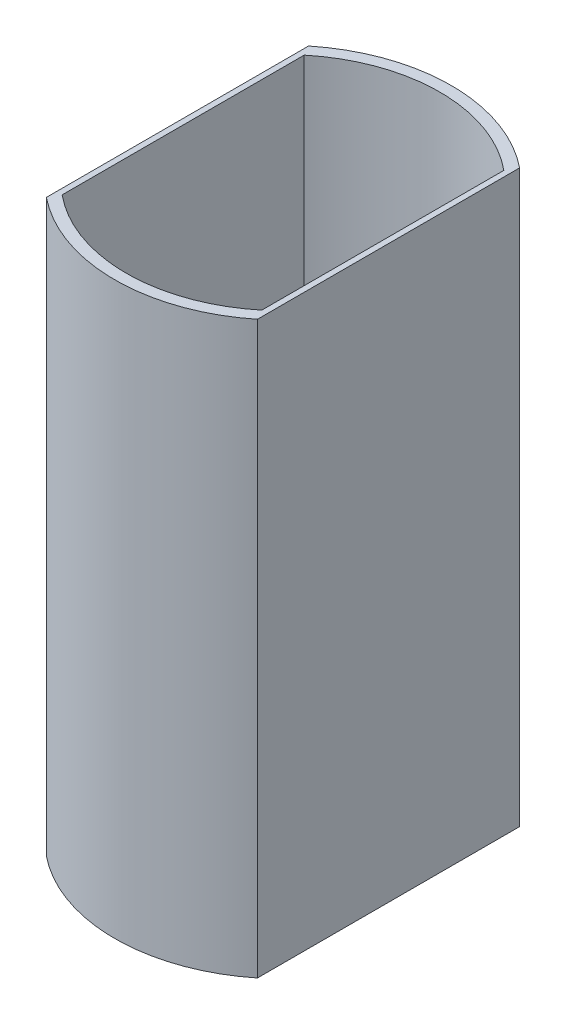
ISO-10303-21;
HEADER;
FILE_DESCRIPTION(('STEP AP214'),'2;1');
FILE_NAME('part.step','',(''),(''),'','','');
FILE_SCHEMA(('AUTOMOTIVE_DESIGN { 1 0 10303 214 1 1 1 1 }'));
ENDSEC;
DATA;
#1=APPLICATION_CONTEXT('core data for automotive mechanical design processes');
#2=APPLICATION_PROTOCOL_DEFINITION('international standard','automotive_design',2000,#1);
#3=PRODUCT_CONTEXT('',#1,'mechanical');
#4=PRODUCT('Part','Part','',(#3));
#5=PRODUCT_RELATED_PRODUCT_CATEGORY('part','',(#4));
#6=PRODUCT_DEFINITION_FORMATION('','',#4);
#7=PRODUCT_DEFINITION_CONTEXT('part definition',#1,'design');
#8=PRODUCT_DEFINITION('design','',#6,#7);
#9=PRODUCT_DEFINITION_SHAPE('','',#8);
#10=(LENGTH_UNIT() NAMED_UNIT(*) SI_UNIT(.MILLI.,.METRE.));
#11=(NAMED_UNIT(*) PLANE_ANGLE_UNIT() SI_UNIT($,.RADIAN.));
#12=(NAMED_UNIT(*) SI_UNIT($,.STERADIAN.) SOLID_ANGLE_UNIT());
#13=UNCERTAINTY_MEASURE_WITH_UNIT(LENGTH_MEASURE(1.E-05),#10,'distance_accuracy_value','');
#14=(GEOMETRIC_REPRESENTATION_CONTEXT(3) GLOBAL_UNCERTAINTY_ASSIGNED_CONTEXT((#13)) GLOBAL_UNIT_ASSIGNED_CONTEXT((#10,
#11,#12)) REPRESENTATION_CONTEXT('',''));
#15=CARTESIAN_POINT('',(0.,0.,0.));
#16=DIRECTION('',(0.,0.,1.));
#17=DIRECTION('',(1.,0.,0.));
#18=AXIS2_PLACEMENT_3D('',#15,#16,#17);
#19=CARTESIAN_POINT('',(0.,10.,0.));
#20=DIRECTION('',(0.,1.,0.));
#21=DIRECTION('',(0.,0.,1.));
#22=AXIS2_PLACEMENT_3D('',#19,#20,#21);
#23=PLANE('',#22);
#24=CARTESIAN_POINT('',(0.,10.,0.));
#25=DIRECTION('',(0.,1.,0.));
#26=DIRECTION('',(0.,0.,1.));
#27=AXIS2_PLACEMENT_3D('',#24,#25,#26);
#28=CIRCLE('',#27,2.95);
#29=CARTESIAN_POINT('',(-1.85,10.,2.29782505861521));
#30=VERTEX_POINT('',#29);
#31=CARTESIAN_POINT('',(1.85,10.,2.29782505861521));
#32=VERTEX_POINT('',#31);
#33=EDGE_CURVE('E136',#30,#32,#28,.T.);
#34=ORIENTED_EDGE('',*,*,#33,.T.);
#35=DIRECTION('',(0.,0.,-1.));
#36=VECTOR('',#35,1.);
#37=CARTESIAN_POINT('',(1.85,10.,-2.29782505861521));
#38=LINE('',#37,#36);
#39=CARTESIAN_POINT('',(1.85,10.,-2.29782505861521));
#40=VERTEX_POINT('',#39);
#41=EDGE_CURVE('E139',#32,#40,#38,.T.);
#42=ORIENTED_EDGE('',*,*,#41,.T.);
#43=CARTESIAN_POINT('',(0.,10.,0.));
#44=DIRECTION('',(0.,1.,0.));
#45=DIRECTION('',(0.,0.,1.));
#46=AXIS2_PLACEMENT_3D('',#43,#44,#45);
#47=CIRCLE('',#46,2.95);
#48=CARTESIAN_POINT('',(-1.85,10.,-2.29782505861521));
#49=VERTEX_POINT('',#48);
#50=EDGE_CURVE('E142',#40,#49,#47,.T.);
#51=ORIENTED_EDGE('',*,*,#50,.T.);
#52=DIRECTION('',(0.,0.,1.));
#53=VECTOR('',#52,1.);
#54=CARTESIAN_POINT('',(-1.85,10.,-2.29782505861521));
#55=LINE('',#54,#53);
#56=EDGE_CURVE('E144',#49,#30,#55,.T.);
#57=ORIENTED_EDGE('',*,*,#56,.T.);
#58=EDGE_LOOP('',(#34,#42,#51,#57));
#59=FACE_BOUND('',#58,.T.);
#60=DIRECTION('',(0.,0.,1.));
#61=VECTOR('',#60,1.);
#62=CARTESIAN_POINT('',(-1.75,10.,-2.12132034355964));
#63=LINE('',#62,#61);
#64=CARTESIAN_POINT('',(-1.75,10.,-2.12132034355964));
#65=VERTEX_POINT('',#64);
#66=CARTESIAN_POINT('',(-1.75,10.,2.12132034355964));
#67=VERTEX_POINT('',#66);
#68=EDGE_CURVE('E108',#65,#67,#63,.T.);
#69=ORIENTED_EDGE('',*,*,#68,.F.);
#70=CARTESIAN_POINT('',(0.,10.,0.));
#71=DIRECTION('',(0.,1.,0.));
#72=DIRECTION('',(0.,0.,1.));
#73=AXIS2_PLACEMENT_3D('',#70,#71,#72);
#74=CIRCLE('',#73,2.75);
#75=CARTESIAN_POINT('',(1.75,10.,-2.12132034355964));
#76=VERTEX_POINT('',#75);
#77=EDGE_CURVE('E100',#76,#65,#74,.T.);
#78=ORIENTED_EDGE('',*,*,#77,.F.);
#79=DIRECTION('',(0.,0.,-1.));
#80=VECTOR('',#79,1.);
#81=CARTESIAN_POINT('',(1.75,10.,-2.12132034355964));
#82=LINE('',#81,#80);
#83=CARTESIAN_POINT('',(1.75,10.,2.12132034355964));
#84=VERTEX_POINT('',#83);
#85=EDGE_CURVE('E122',#84,#76,#82,.T.);
#86=ORIENTED_EDGE('',*,*,#85,.F.);
#87=CARTESIAN_POINT('',(0.,10.,0.));
#88=DIRECTION('',(0.,1.,0.));
#89=DIRECTION('',(0.,0.,1.));
#90=AXIS2_PLACEMENT_3D('',#87,#88,#89);
#91=CIRCLE('',#90,2.75);
#92=EDGE_CURVE('E120',#67,#84,#91,.T.);
#93=ORIENTED_EDGE('',*,*,#92,.F.);
#94=EDGE_LOOP('',(#69,#78,#86,#93));
#95=FACE_BOUND('',#94,.T.);
#96=ADVANCED_FACE('F35',(#59,#95),#23,.T.);
#97=CARTESIAN_POINT('',(0.,0.,0.));
#98=DIRECTION('',(0.,1.,0.));
#99=DIRECTION('',(0.,0.,1.));
#100=AXIS2_PLACEMENT_3D('',#97,#98,#99);
#101=PLANE('',#100);
#102=CARTESIAN_POINT('',(0.,0.,0.));
#103=DIRECTION('',(0.,1.,0.));
#104=DIRECTION('',(0.,0.,1.));
#105=AXIS2_PLACEMENT_3D('',#102,#103,#104);
#106=CIRCLE('',#105,2.95);
#107=CARTESIAN_POINT('',(-1.85,0.,2.29782505861521));
#108=VERTEX_POINT('',#107);
#109=CARTESIAN_POINT('',(1.85,0.,2.29782505861521));
#110=VERTEX_POINT('',#109);
#111=EDGE_CURVE('E116',#108,#110,#106,.T.);
#112=ORIENTED_EDGE('',*,*,#111,.F.);
#113=DIRECTION('',(0.,0.,1.));
#114=VECTOR('',#113,1.);
#115=CARTESIAN_POINT('',(-1.85,0.,-2.29782505861521));
#116=LINE('',#115,#114);
#117=CARTESIAN_POINT('',(-1.85,0.,-2.29782505861521));
#118=VERTEX_POINT('',#117);
#119=EDGE_CURVE('E140',#118,#108,#116,.T.);
#120=ORIENTED_EDGE('',*,*,#119,.F.);
#121=CARTESIAN_POINT('',(0.,0.,0.));
#122=DIRECTION('',(0.,1.,0.));
#123=DIRECTION('',(0.,0.,1.));
#124=AXIS2_PLACEMENT_3D('',#121,#122,#123);
#125=CIRCLE('',#124,2.95);
#126=CARTESIAN_POINT('',(1.85,0.,-2.29782505861521));
#127=VERTEX_POINT('',#126);
#128=EDGE_CURVE('E151',#127,#118,#125,.T.);
#129=ORIENTED_EDGE('',*,*,#128,.F.);
#130=DIRECTION('',(0.,0.,-1.));
#131=VECTOR('',#130,1.);
#132=CARTESIAN_POINT('',(1.85,0.,-2.29782505861521));
#133=LINE('',#132,#131);
#134=EDGE_CURVE('E149',#110,#127,#133,.T.);
#135=ORIENTED_EDGE('',*,*,#134,.F.);
#136=EDGE_LOOP('',(#112,#120,#129,#135));
#137=FACE_BOUND('',#136,.T.);
#138=CARTESIAN_POINT('',(0.,0.,0.));
#139=DIRECTION('',(0.,1.,0.));
#140=DIRECTION('',(0.,0.,1.));
#141=AXIS2_PLACEMENT_3D('',#138,#139,#140);
#142=CIRCLE('',#141,2.75);
#143=CARTESIAN_POINT('',(1.75,0.,-2.12132034355964));
#144=VERTEX_POINT('',#143);
#145=CARTESIAN_POINT('',(-1.75,0.,-2.12132034355964));
#146=VERTEX_POINT('',#145);
#147=EDGE_CURVE('E58',#144,#146,#142,.T.);
#148=ORIENTED_EDGE('',*,*,#147,.T.);
#149=DIRECTION('',(0.,0.,1.));
#150=VECTOR('',#149,1.);
#151=CARTESIAN_POINT('',(-1.75,0.,-2.12132034355964));
#152=LINE('',#151,#150);
#153=CARTESIAN_POINT('',(-1.75,0.,2.12132034355964));
#154=VERTEX_POINT('',#153);
#155=EDGE_CURVE('E115',#146,#154,#152,.T.);
#156=ORIENTED_EDGE('',*,*,#155,.T.);
#157=CARTESIAN_POINT('',(0.,0.,0.));
#158=DIRECTION('',(0.,1.,0.));
#159=DIRECTION('',(0.,0.,1.));
#160=AXIS2_PLACEMENT_3D('',#157,#158,#159);
#161=CIRCLE('',#160,2.75);
#162=CARTESIAN_POINT('',(1.75,0.,2.12132034355964));
#163=VERTEX_POINT('',#162);
#164=EDGE_CURVE('E128',#154,#163,#161,.T.);
#165=ORIENTED_EDGE('',*,*,#164,.T.);
#166=DIRECTION('',(0.,0.,-1.));
#167=VECTOR('',#166,1.);
#168=CARTESIAN_POINT('',(1.75,0.,-2.12132034355964));
#169=LINE('',#168,#167);
#170=EDGE_CURVE('E109',#163,#144,#169,.T.);
#171=ORIENTED_EDGE('',*,*,#170,.T.);
#172=EDGE_LOOP('',(#148,#156,#165,#171));
#173=FACE_BOUND('',#172,.T.);
#174=ADVANCED_FACE('F169',(#137,#173),#101,.F.);
#175=CARTESIAN_POINT('',(0.,10.,0.));
#176=DIRECTION('',(0.,-1.,0.));
#177=DIRECTION('',(0.,0.,-1.));
#178=AXIS2_PLACEMENT_3D('',#175,#176,#177);
#179=CYLINDRICAL_SURFACE('',#178,2.95);
#180=ORIENTED_EDGE('',*,*,#111,.T.);
#181=DIRECTION('',(0.,-1.,0.));
#182=VECTOR('',#181,1.);
#183=CARTESIAN_POINT('',(1.85,10.,2.29782505861521));
#184=LINE('',#183,#182);
#185=EDGE_CURVE('E11',#32,#110,#184,.T.);
#186=ORIENTED_EDGE('',*,*,#185,.F.);
#187=ORIENTED_EDGE('',*,*,#33,.F.);
#188=DIRECTION('',(0.,-1.,0.));
#189=VECTOR('',#188,1.);
#190=CARTESIAN_POINT('',(-1.85,10.,2.29782505861521));
#191=LINE('',#190,#189);
#192=EDGE_CURVE('E146',#30,#108,#191,.T.);
#193=ORIENTED_EDGE('',*,*,#192,.T.);
#194=EDGE_LOOP('',(#180,#186,#187,#193));
#195=FACE_BOUND('',#194,.T.);
#196=ADVANCED_FACE('F37',(#195),#179,.T.);
#197=CARTESIAN_POINT('',(1.85,10.,-2.29782505861521));
#198=DIRECTION('',(-1.,0.,0.));
#199=DIRECTION('',(0.,0.,1.));
#200=AXIS2_PLACEMENT_3D('',#197,#198,#199);
#201=PLANE('',#200);
#202=ORIENTED_EDGE('',*,*,#134,.T.);
#203=DIRECTION('',(0.,-1.,0.));
#204=VECTOR('',#203,1.);
#205=CARTESIAN_POINT('',(1.85,10.,-2.29782505861521));
#206=LINE('',#205,#204);
#207=EDGE_CURVE('E43',#40,#127,#206,.T.);
#208=ORIENTED_EDGE('',*,*,#207,.F.);
#209=ORIENTED_EDGE('',*,*,#41,.F.);
#210=ORIENTED_EDGE('',*,*,#185,.T.);
#211=EDGE_LOOP('',(#202,#208,#209,#210));
#212=FACE_BOUND('',#211,.T.);
#213=ADVANCED_FACE('F179',(#212),#201,.F.);
#214=CARTESIAN_POINT('',(0.,10.,0.));
#215=DIRECTION('',(0.,-1.,0.));
#216=DIRECTION('',(0.,0.,-1.));
#217=AXIS2_PLACEMENT_3D('',#214,#215,#216);
#218=CYLINDRICAL_SURFACE('',#217,2.95);
#219=ORIENTED_EDGE('',*,*,#128,.T.);
#220=DIRECTION('',(0.,-1.,0.));
#221=VECTOR('',#220,1.);
#222=CARTESIAN_POINT('',(-1.85,10.,-2.29782505861521));
#223=LINE('',#222,#221);
#224=EDGE_CURVE('E156',#49,#118,#223,.T.);
#225=ORIENTED_EDGE('',*,*,#224,.F.);
#226=ORIENTED_EDGE('',*,*,#50,.F.);
#227=ORIENTED_EDGE('',*,*,#207,.T.);
#228=EDGE_LOOP('',(#219,#225,#226,#227));
#229=FACE_BOUND('',#228,.T.);
#230=ADVANCED_FACE('F163',(#229),#218,.T.);
#231=CARTESIAN_POINT('',(-1.85,10.,-2.29782505861521));
#232=DIRECTION('',(1.,0.,0.));
#233=DIRECTION('',(0.,0.,-1.));
#234=AXIS2_PLACEMENT_3D('',#231,#232,#233);
#235=PLANE('',#234);
#236=ORIENTED_EDGE('',*,*,#119,.T.);
#237=ORIENTED_EDGE('',*,*,#192,.F.);
#238=ORIENTED_EDGE('',*,*,#56,.F.);
#239=ORIENTED_EDGE('',*,*,#224,.T.);
#240=EDGE_LOOP('',(#236,#237,#238,#239));
#241=FACE_BOUND('',#240,.T.);
#242=ADVANCED_FACE('F173',(#241),#235,.F.);
#243=CARTESIAN_POINT('',(0.,10.,0.));
#244=DIRECTION('',(0.,-1.,0.));
#245=DIRECTION('',(0.,0.,-1.));
#246=AXIS2_PLACEMENT_3D('',#243,#244,#245);
#247=CYLINDRICAL_SURFACE('',#246,2.75);
#248=ORIENTED_EDGE('',*,*,#147,.F.);
#249=DIRECTION('',(0.,-1.,0.));
#250=VECTOR('',#249,1.);
#251=CARTESIAN_POINT('',(1.75,10.,-2.12132034355964));
#252=LINE('',#251,#250);
#253=EDGE_CURVE('E104',#76,#144,#252,.T.);
#254=ORIENTED_EDGE('',*,*,#253,.F.);
#255=ORIENTED_EDGE('',*,*,#77,.T.);
#256=DIRECTION('',(0.,-1.,0.));
#257=VECTOR('',#256,1.);
#258=CARTESIAN_POINT('',(-1.75,10.,-2.12132034355964));
#259=LINE('',#258,#257);
#260=EDGE_CURVE('E103',#65,#146,#259,.T.);
#261=ORIENTED_EDGE('',*,*,#260,.T.);
#262=EDGE_LOOP('',(#248,#254,#255,#261));
#263=FACE_BOUND('',#262,.T.);
#264=ADVANCED_FACE('F102',(#263),#247,.F.);
#265=CARTESIAN_POINT('',(-1.75,10.,-2.12132034355964));
#266=DIRECTION('',(1.,0.,0.));
#267=DIRECTION('',(0.,0.,-1.));
#268=AXIS2_PLACEMENT_3D('',#265,#266,#267);
#269=PLANE('',#268);
#270=ORIENTED_EDGE('',*,*,#155,.F.);
#271=ORIENTED_EDGE('',*,*,#260,.F.);
#272=ORIENTED_EDGE('',*,*,#68,.T.);
#273=DIRECTION('',(0.,-1.,0.));
#274=VECTOR('',#273,1.);
#275=CARTESIAN_POINT('',(-1.75,10.,2.12132034355964));
#276=LINE('',#275,#274);
#277=EDGE_CURVE('E117',#67,#154,#276,.T.);
#278=ORIENTED_EDGE('',*,*,#277,.T.);
#279=EDGE_LOOP('',(#270,#271,#272,#278));
#280=FACE_BOUND('',#279,.T.);
#281=ADVANCED_FACE('F112',(#280),#269,.T.);
#282=CARTESIAN_POINT('',(0.,10.,0.));
#283=DIRECTION('',(0.,-1.,0.));
#284=DIRECTION('',(0.,0.,-1.));
#285=AXIS2_PLACEMENT_3D('',#282,#283,#284);
#286=CYLINDRICAL_SURFACE('',#285,2.75);
#287=ORIENTED_EDGE('',*,*,#164,.F.);
#288=ORIENTED_EDGE('',*,*,#277,.F.);
#289=ORIENTED_EDGE('',*,*,#92,.T.);
#290=DIRECTION('',(0.,-1.,0.));
#291=VECTOR('',#290,1.);
#292=CARTESIAN_POINT('',(1.75,10.,2.12132034355964));
#293=LINE('',#292,#291);
#294=EDGE_CURVE('E50',#84,#163,#293,.T.);
#295=ORIENTED_EDGE('',*,*,#294,.T.);
#296=EDGE_LOOP('',(#287,#288,#289,#295));
#297=FACE_BOUND('',#296,.T.);
#298=ADVANCED_FACE('F202',(#297),#286,.F.);
#299=CARTESIAN_POINT('',(1.75,10.,-2.12132034355964));
#300=DIRECTION('',(-1.,0.,0.));
#301=DIRECTION('',(0.,0.,1.));
#302=AXIS2_PLACEMENT_3D('',#299,#300,#301);
#303=PLANE('',#302);
#304=ORIENTED_EDGE('',*,*,#170,.F.);
#305=ORIENTED_EDGE('',*,*,#294,.F.);
#306=ORIENTED_EDGE('',*,*,#85,.T.);
#307=ORIENTED_EDGE('',*,*,#253,.T.);
#308=EDGE_LOOP('',(#304,#305,#306,#307));
#309=FACE_BOUND('',#308,.T.);
#310=ADVANCED_FACE('F206',(#309),#303,.T.);
#311=CLOSED_SHELL('',(#96,#174,#196,#213,#230,#242,#264,#281,#298,#310));
#312=MANIFOLD_SOLID_BREP('B2',#311);
#313=ADVANCED_BREP_SHAPE_REPRESENTATION('',(#18,#312),#14);
#314=SHAPE_DEFINITION_REPRESENTATION(#9,#313);
ENDSEC;
END-ISO-10303-21;
